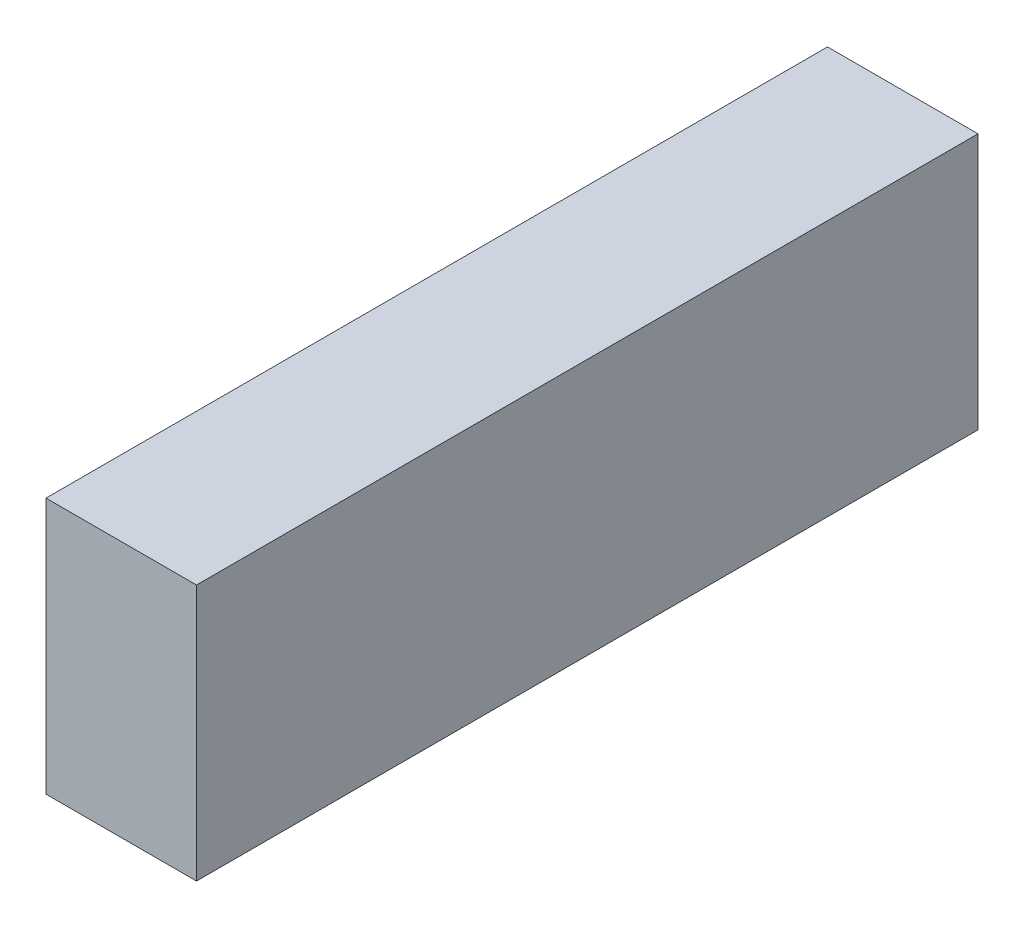
ISO-10303-21;
HEADER;
FILE_DESCRIPTION(('STEP AP214'),'2;1');
FILE_NAME('part.step','',(''),(''),'','','');
FILE_SCHEMA(('AUTOMOTIVE_DESIGN { 1 0 10303 214 1 1 1 1 }'));
ENDSEC;
DATA;
#1=APPLICATION_CONTEXT('core data for automotive mechanical design processes');
#2=APPLICATION_PROTOCOL_DEFINITION('international standard','automotive_design',2000,#1);
#3=PRODUCT_CONTEXT('',#1,'mechanical');
#4=PRODUCT('Part','Part','',(#3));
#5=PRODUCT_RELATED_PRODUCT_CATEGORY('part','',(#4));
#6=PRODUCT_DEFINITION_FORMATION('','',#4);
#7=PRODUCT_DEFINITION_CONTEXT('part definition',#1,'design');
#8=PRODUCT_DEFINITION('design','',#6,#7);
#9=PRODUCT_DEFINITION_SHAPE('','',#8);
#10=(LENGTH_UNIT() NAMED_UNIT(*) SI_UNIT(.MILLI.,.METRE.));
#11=(NAMED_UNIT(*) PLANE_ANGLE_UNIT() SI_UNIT($,.RADIAN.));
#12=(NAMED_UNIT(*) SI_UNIT($,.STERADIAN.) SOLID_ANGLE_UNIT());
#13=UNCERTAINTY_MEASURE_WITH_UNIT(LENGTH_MEASURE(1.E-05),#10,'distance_accuracy_value','');
#14=(GEOMETRIC_REPRESENTATION_CONTEXT(3) GLOBAL_UNCERTAINTY_ASSIGNED_CONTEXT((#13)) GLOBAL_UNIT_ASSIGNED_CONTEXT((#10,
#11,#12)) REPRESENTATION_CONTEXT('',''));
#15=CARTESIAN_POINT('',(0.,0.,0.));
#16=DIRECTION('',(0.,0.,1.));
#17=DIRECTION('',(1.,0.,0.));
#18=AXIS2_PLACEMENT_3D('',#15,#16,#17);
#19=CARTESIAN_POINT('',(-8.554037880301,-3.700180261412,-5.5));
#20=DIRECTION('',(0.,0.,1.));
#21=DIRECTION('',(0.,-1.,0.));
#22=AXIS2_PLACEMENT_3D('',#19,#20,#21);
#23=PLANE('',#22);
#24=DIRECTION('',(-1.,0.,0.));
#25=VECTOR('',#24,1.);
#26=CARTESIAN_POINT('',(-8.457736602523,-3.536130128079,-5.5));
#27=LINE('',#26,#25);
#28=CARTESIAN_POINT('',(-8.457736602523,-3.536130128079,-5.5));
#29=VERTEX_POINT('',#28);
#30=CARTESIAN_POINT('',(-8.650339158079,-3.536130128079,-5.5));
#31=VERTEX_POINT('',#30);
#32=EDGE_CURVE('E76',#29,#31,#27,.T.);
#33=ORIENTED_EDGE('',*,*,#32,.T.);
#34=DIRECTION('',(0.,-1.,0.));
#35=VECTOR('',#34,1.);
#36=CARTESIAN_POINT('',(-8.650339158079,-3.536130128079,-5.5));
#37=LINE('',#36,#35);
#38=CARTESIAN_POINT('',(-8.650339158079,-3.864230394746,-5.5));
#39=VERTEX_POINT('',#38);
#40=EDGE_CURVE('E74',#31,#39,#37,.T.);
#41=ORIENTED_EDGE('',*,*,#40,.T.);
#42=DIRECTION('',(1.,0.,0.));
#43=VECTOR('',#42,1.);
#44=CARTESIAN_POINT('',(-8.650339158079,-3.864230394746,-5.5));
#45=LINE('',#44,#43);
#46=CARTESIAN_POINT('',(-8.457736602523,-3.864230394746,-5.5));
#47=VERTEX_POINT('',#46);
#48=EDGE_CURVE('E62',#39,#47,#45,.T.);
#49=ORIENTED_EDGE('',*,*,#48,.T.);
#50=DIRECTION('',(0.,1.,0.));
#51=VECTOR('',#50,1.);
#52=CARTESIAN_POINT('',(-8.457736602523,-3.864230394746,-5.5));
#53=LINE('',#52,#51);
#54=EDGE_CURVE('E11',#47,#29,#53,.T.);
#55=ORIENTED_EDGE('',*,*,#54,.T.);
#56=EDGE_LOOP('',(#33,#41,#49,#55));
#57=FACE_BOUND('',#56,.T.);
#58=ADVANCED_FACE('F16',(#57),#23,.T.);
#59=CARTESIAN_POINT('',(-8.554037880301,-3.700180261412,-6.5));
#60=DIRECTION('',(0.,0.,1.));
#61=DIRECTION('',(0.,-1.,0.));
#62=AXIS2_PLACEMENT_3D('',#59,#60,#61);
#63=PLANE('',#62);
#64=DIRECTION('',(-1.,0.,0.));
#65=VECTOR('',#64,1.);
#66=CARTESIAN_POINT('',(-8.457736602523,-3.536130128079,-6.5));
#67=LINE('',#66,#65);
#68=CARTESIAN_POINT('',(-8.457736602523,-3.536130128079,-6.5));
#69=VERTEX_POINT('',#68);
#70=CARTESIAN_POINT('',(-8.650339158079,-3.536130128079,-6.5));
#71=VERTEX_POINT('',#70);
#72=EDGE_CURVE('E97',#69,#71,#67,.T.);
#73=ORIENTED_EDGE('',*,*,#72,.F.);
#74=DIRECTION('',(0.,1.,0.));
#75=VECTOR('',#74,1.);
#76=CARTESIAN_POINT('',(-8.457736602523,-3.864230394746,-6.5));
#77=LINE('',#76,#75);
#78=CARTESIAN_POINT('',(-8.457736602523,-3.864230394746,-6.5));
#79=VERTEX_POINT('',#78);
#80=EDGE_CURVE('E26',#79,#69,#77,.T.);
#81=ORIENTED_EDGE('',*,*,#80,.F.);
#82=DIRECTION('',(1.,0.,0.));
#83=VECTOR('',#82,1.);
#84=CARTESIAN_POINT('',(-8.650339158079,-3.864230394746,-6.5));
#85=LINE('',#84,#83);
#86=CARTESIAN_POINT('',(-8.650339158079,-3.864230394746,-6.5));
#87=VERTEX_POINT('',#86);
#88=EDGE_CURVE('E81',#87,#79,#85,.T.);
#89=ORIENTED_EDGE('',*,*,#88,.F.);
#90=DIRECTION('',(0.,-1.,0.));
#91=VECTOR('',#90,1.);
#92=CARTESIAN_POINT('',(-8.650339158079,-3.536130128079,-6.5));
#93=LINE('',#92,#91);
#94=EDGE_CURVE('E83',#71,#87,#93,.T.);
#95=ORIENTED_EDGE('',*,*,#94,.F.);
#96=EDGE_LOOP('',(#73,#81,#89,#95));
#97=FACE_BOUND('',#96,.T.);
#98=ADVANCED_FACE('F117',(#97),#63,.F.);
#99=CARTESIAN_POINT('',(-8.457736602523,-3.7001802614125,-5.49));
#100=DIRECTION('',(-1.,0.,0.));
#101=DIRECTION('',(0.,1.,0.));
#102=AXIS2_PLACEMENT_3D('',#99,#100,#101);
#103=PLANE('',#102);
#104=DIRECTION('',(0.,0.,1.));
#105=VECTOR('',#104,1.);
#106=CARTESIAN_POINT('',(-8.457736602523,-3.864230394746,-6.5));
#107=LINE('',#106,#105);
#108=EDGE_CURVE('E69',#79,#47,#107,.T.);
#109=ORIENTED_EDGE('',*,*,#108,.F.);
#110=ORIENTED_EDGE('',*,*,#80,.T.);
#111=DIRECTION('',(0.,0.,1.));
#112=VECTOR('',#111,1.);
#113=CARTESIAN_POINT('',(-8.457736602523,-3.536130128079,-6.5));
#114=LINE('',#113,#112);
#115=EDGE_CURVE('E103',#69,#29,#114,.T.);
#116=ORIENTED_EDGE('',*,*,#115,.T.);
#117=ORIENTED_EDGE('',*,*,#54,.F.);
#118=EDGE_LOOP('',(#109,#110,#116,#117));
#119=FACE_BOUND('',#118,.T.);
#120=ADVANCED_FACE('F114',(#119),#103,.F.);
#121=CARTESIAN_POINT('',(-8.554037880301,-3.864230394746,-5.49));
#122=DIRECTION('',(0.,1.,0.));
#123=DIRECTION('',(-1.,0.,0.));
#124=AXIS2_PLACEMENT_3D('',#121,#122,#123);
#125=PLANE('',#124);
#126=DIRECTION('',(0.,0.,1.));
#127=VECTOR('',#126,1.);
#128=CARTESIAN_POINT('',(-8.650339158079,-3.864230394746,-6.5));
#129=LINE('',#128,#127);
#130=EDGE_CURVE('E67',#87,#39,#129,.T.);
#131=ORIENTED_EDGE('',*,*,#130,.F.);
#132=ORIENTED_EDGE('',*,*,#88,.T.);
#133=ORIENTED_EDGE('',*,*,#108,.T.);
#134=ORIENTED_EDGE('',*,*,#48,.F.);
#135=EDGE_LOOP('',(#131,#132,#133,#134));
#136=FACE_BOUND('',#135,.T.);
#137=ADVANCED_FACE('F64',(#136),#125,.F.);
#138=CARTESIAN_POINT('',(-8.650339158079,-3.7001802614125,-5.49));
#139=DIRECTION('',(1.,0.,0.));
#140=DIRECTION('',(0.,0.,-1.));
#141=AXIS2_PLACEMENT_3D('',#138,#139,#140);
#142=PLANE('',#141);
#143=DIRECTION('',(0.,0.,1.));
#144=VECTOR('',#143,1.);
#145=CARTESIAN_POINT('',(-8.650339158079,-3.536130128079,-6.5));
#146=LINE('',#145,#144);
#147=EDGE_CURVE('E93',#71,#31,#146,.T.);
#148=ORIENTED_EDGE('',*,*,#147,.F.);
#149=ORIENTED_EDGE('',*,*,#94,.T.);
#150=ORIENTED_EDGE('',*,*,#130,.T.);
#151=ORIENTED_EDGE('',*,*,#40,.F.);
#152=EDGE_LOOP('',(#148,#149,#150,#151));
#153=FACE_BOUND('',#152,.T.);
#154=ADVANCED_FACE('F18',(#153),#142,.F.);
#155=CARTESIAN_POINT('',(-8.554037880301,-3.536130128079,-5.49));
#156=DIRECTION('',(0.,-1.,0.));
#157=DIRECTION('',(0.,0.,1.));
#158=AXIS2_PLACEMENT_3D('',#155,#156,#157);
#159=PLANE('',#158);
#160=ORIENTED_EDGE('',*,*,#115,.F.);
#161=ORIENTED_EDGE('',*,*,#72,.T.);
#162=ORIENTED_EDGE('',*,*,#147,.T.);
#163=ORIENTED_EDGE('',*,*,#32,.F.);
#164=EDGE_LOOP('',(#160,#161,#162,#163));
#165=FACE_BOUND('',#164,.T.);
#166=ADVANCED_FACE('F118',(#165),#159,.F.);
#167=CLOSED_SHELL('',(#58,#98,#120,#137,#154,#166));
#168=MANIFOLD_SOLID_BREP('B1',#167);
#169=ADVANCED_BREP_SHAPE_REPRESENTATION('',(#18,#168),#14);
#170=SHAPE_DEFINITION_REPRESENTATION(#9,#169);
ENDSEC;
END-ISO-10303-21;
